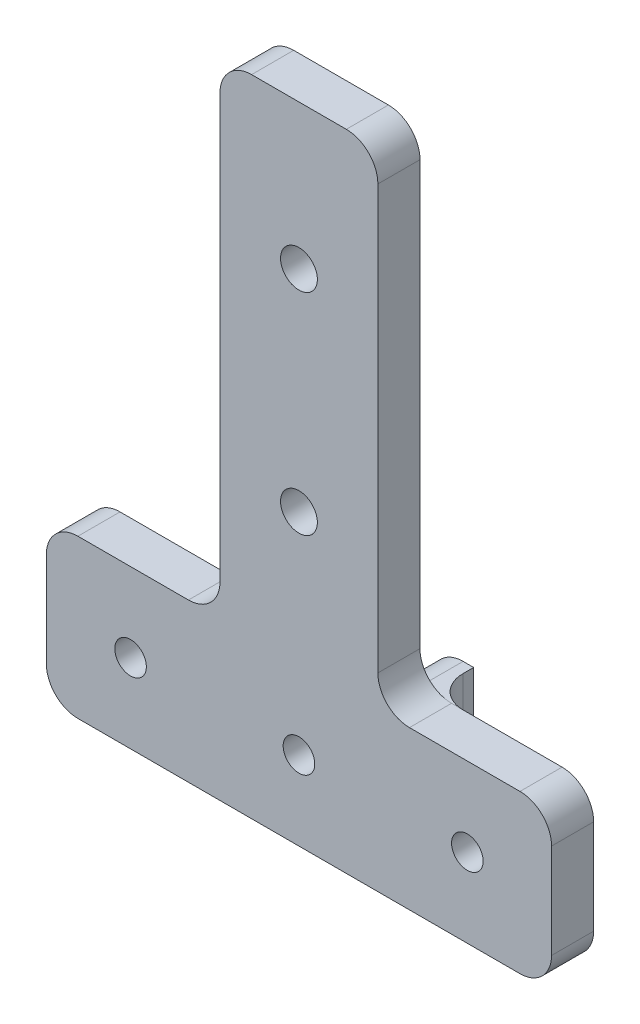
ISO-10303-21;
HEADER;
FILE_DESCRIPTION(('STEP AP214'),'2;1');
FILE_NAME('part.step','',(''),(''),'','','');
FILE_SCHEMA(('AUTOMOTIVE_DESIGN { 1 0 10303 214 1 1 1 1 }'));
ENDSEC;
DATA;
#1=APPLICATION_CONTEXT('core data for automotive mechanical design processes');
#2=APPLICATION_PROTOCOL_DEFINITION('international standard','automotive_design',2000,#1);
#3=PRODUCT_CONTEXT('',#1,'mechanical');
#4=PRODUCT('Part','Part','',(#3));
#5=PRODUCT_RELATED_PRODUCT_CATEGORY('part','',(#4));
#6=PRODUCT_DEFINITION_FORMATION('','',#4);
#7=PRODUCT_DEFINITION_CONTEXT('part definition',#1,'design');
#8=PRODUCT_DEFINITION('design','',#6,#7);
#9=PRODUCT_DEFINITION_SHAPE('','',#8);
#10=(LENGTH_UNIT() NAMED_UNIT(*) SI_UNIT(.MILLI.,.METRE.));
#11=(NAMED_UNIT(*) PLANE_ANGLE_UNIT() SI_UNIT($,.RADIAN.));
#12=(NAMED_UNIT(*) SI_UNIT($,.STERADIAN.) SOLID_ANGLE_UNIT());
#13=UNCERTAINTY_MEASURE_WITH_UNIT(LENGTH_MEASURE(1.E-05),#10,'distance_accuracy_value','');
#14=(GEOMETRIC_REPRESENTATION_CONTEXT(3) GLOBAL_UNCERTAINTY_ASSIGNED_CONTEXT((#13)) GLOBAL_UNIT_ASSIGNED_CONTEXT((#10,
#11,#12)) REPRESENTATION_CONTEXT('',''));
#15=CARTESIAN_POINT('',(0.,0.,0.));
#16=DIRECTION('',(0.,0.,1.));
#17=DIRECTION('',(1.,0.,0.));
#18=AXIS2_PLACEMENT_3D('',#15,#16,#17);
#19=CARTESIAN_POINT('',(0.,0.,0.));
#20=DIRECTION('',(0.,0.,1.));
#21=DIRECTION('',(1.,0.,0.));
#22=AXIS2_PLACEMENT_3D('',#19,#20,#21);
#23=PLANE('',#22);
#24=CARTESIAN_POINT('',(-16.,0.,0.));
#25=DIRECTION('',(0.,0.,1.));
#26=DIRECTION('',(1.,0.,0.));
#27=AXIS2_PLACEMENT_3D('',#24,#25,#26);
#28=CIRCLE('',#27,1.5);
#29=CARTESIAN_POINT('',(-14.5,0.,0.));
#30=VERTEX_POINT('',#29);
#31=EDGE_CURVE('E298',#30,#30,#28,.F.);
#32=ORIENTED_EDGE('',*,*,#31,.F.);
#33=EDGE_LOOP('',(#32));
#34=FACE_BOUND('',#33,.T.);
#35=DIRECTION('',(-1.,0.,0.));
#36=VECTOR('',#35,1.);
#37=CARTESIAN_POINT('',(0.,7.5,0.));
#38=LINE('',#37,#36);
#39=CARTESIAN_POINT('',(-11.6,7.5,0.));
#40=VERTEX_POINT('',#39);
#41=CARTESIAN_POINT('',(-21.,7.5,0.));
#42=VERTEX_POINT('',#41);
#43=EDGE_CURVE('E358',#40,#42,#38,.T.);
#44=ORIENTED_EDGE('',*,*,#43,.F.);
#45=DIRECTION('',(0.,-1.,0.));
#46=VECTOR('',#45,1.);
#47=CARTESIAN_POINT('',(-11.6,0.,0.));
#48=LINE('',#47,#46);
#49=CARTESIAN_POINT('',(-11.6,-7.5,0.));
#50=VERTEX_POINT('',#49);
#51=EDGE_CURVE('E508',#40,#50,#48,.T.);
#52=ORIENTED_EDGE('',*,*,#51,.T.);
#53=DIRECTION('',(-1.,0.,0.));
#54=VECTOR('',#53,1.);
#55=CARTESIAN_POINT('',(0.,-7.5,0.));
#56=LINE('',#55,#54);
#57=CARTESIAN_POINT('',(-21.,-7.5,0.));
#58=VERTEX_POINT('',#57);
#59=EDGE_CURVE('E367',#50,#58,#56,.T.);
#60=ORIENTED_EDGE('',*,*,#59,.T.);
#61=CARTESIAN_POINT('',(-21.,-4.5,0.));
#62=DIRECTION('',(0.,0.,1.));
#63=DIRECTION('',(1.,0.,0.));
#64=AXIS2_PLACEMENT_3D('',#61,#62,#63);
#65=CIRCLE('',#64,3.);
#66=CARTESIAN_POINT('',(-24.,-4.5,0.));
#67=VERTEX_POINT('',#66);
#68=EDGE_CURVE('E409',#58,#67,#65,.F.);
#69=ORIENTED_EDGE('',*,*,#68,.T.);
#70=DIRECTION('',(0.,-1.,0.));
#71=VECTOR('',#70,1.);
#72=CARTESIAN_POINT('',(-24.,0.,0.));
#73=LINE('',#72,#71);
#74=CARTESIAN_POINT('',(-24.,4.5,0.));
#75=VERTEX_POINT('',#74);
#76=EDGE_CURVE('E363',#75,#67,#73,.T.);
#77=ORIENTED_EDGE('',*,*,#76,.F.);
#78=CARTESIAN_POINT('',(-21.,4.5,0.));
#79=DIRECTION('',(0.,0.,1.));
#80=DIRECTION('',(1.,0.,0.));
#81=AXIS2_PLACEMENT_3D('',#78,#79,#80);
#82=CIRCLE('',#81,3.);
#83=EDGE_CURVE('E405',#75,#42,#82,.F.);
#84=ORIENTED_EDGE('',*,*,#83,.T.);
#85=EDGE_LOOP('',(#44,#52,#60,#69,#77,#84));
#86=FACE_BOUND('',#85,.T.);
#87=ADVANCED_FACE('F44',(#34,#86),#23,.F.);
#88=CARTESIAN_POINT('',(16.,0.,0.));
#89=DIRECTION('',(0.,0.,1.));
#90=DIRECTION('',(1.,0.,0.));
#91=AXIS2_PLACEMENT_3D('',#88,#89,#90);
#92=CIRCLE('',#91,1.5);
#93=CARTESIAN_POINT('',(17.5,0.,0.));
#94=VERTEX_POINT('',#93);
#95=EDGE_CURVE('E388',#94,#94,#92,.T.);
#96=ORIENTED_EDGE('',*,*,#95,.T.);
#97=EDGE_LOOP('',(#96));
#98=FACE_BOUND('',#97,.T.);
#99=CARTESIAN_POINT('',(21.,-7.5,0.));
#100=VERTEX_POINT('',#99);
#101=CARTESIAN_POINT('',(11.6,-7.5,0.));
#102=VERTEX_POINT('',#101);
#103=EDGE_CURVE('E368',#100,#102,#56,.T.);
#104=ORIENTED_EDGE('',*,*,#103,.T.);
#105=DIRECTION('',(0.,-1.,0.));
#106=VECTOR('',#105,1.);
#107=CARTESIAN_POINT('',(11.6,7.5,0.));
#108=LINE('',#107,#106);
#109=CARTESIAN_POINT('',(11.6,7.5,0.));
#110=VERTEX_POINT('',#109);
#111=EDGE_CURVE('E504',#102,#110,#108,.F.);
#112=ORIENTED_EDGE('',*,*,#111,.T.);
#113=DIRECTION('',(1.,0.,0.));
#114=VECTOR('',#113,1.);
#115=CARTESIAN_POINT('',(0.,7.5,0.));
#116=LINE('',#115,#114);
#117=CARTESIAN_POINT('',(21.,7.5,0.));
#118=VERTEX_POINT('',#117);
#119=EDGE_CURVE('E376',#110,#118,#116,.T.);
#120=ORIENTED_EDGE('',*,*,#119,.T.);
#121=CARTESIAN_POINT('',(21.,4.5,0.));
#122=DIRECTION('',(0.,0.,1.));
#123=DIRECTION('',(1.,0.,0.));
#124=AXIS2_PLACEMENT_3D('',#121,#122,#123);
#125=CIRCLE('',#124,3.);
#126=CARTESIAN_POINT('',(24.,4.5,0.));
#127=VERTEX_POINT('',#126);
#128=EDGE_CURVE('E415',#118,#127,#125,.F.);
#129=ORIENTED_EDGE('',*,*,#128,.T.);
#130=DIRECTION('',(0.,-1.,0.));
#131=VECTOR('',#130,1.);
#132=CARTESIAN_POINT('',(24.,0.,0.));
#133=LINE('',#132,#131);
#134=CARTESIAN_POINT('',(24.,-4.5,0.));
#135=VERTEX_POINT('',#134);
#136=EDGE_CURVE('E372',#127,#135,#133,.T.);
#137=ORIENTED_EDGE('',*,*,#136,.T.);
#138=CARTESIAN_POINT('',(21.,-4.5,0.));
#139=DIRECTION('',(0.,0.,1.));
#140=DIRECTION('',(1.,0.,0.));
#141=AXIS2_PLACEMENT_3D('',#138,#139,#140);
#142=CIRCLE('',#141,3.);
#143=EDGE_CURVE('E412',#135,#100,#142,.F.);
#144=ORIENTED_EDGE('',*,*,#143,.T.);
#145=EDGE_LOOP('',(#104,#112,#120,#129,#137,#144));
#146=FACE_BOUND('',#145,.T.);
#147=ADVANCED_FACE('F610',(#98,#146),#23,.F.);
#148=CARTESIAN_POINT('',(0.,0.,0.));
#149=DIRECTION('',(0.,0.,1.));
#150=DIRECTION('',(1.,0.,0.));
#151=AXIS2_PLACEMENT_3D('',#148,#149,#150);
#152=CIRCLE('',#151,1.5);
#153=CARTESIAN_POINT('',(1.5,0.,0.));
#154=VERTEX_POINT('',#153);
#155=EDGE_CURVE('E392',#154,#154,#152,.T.);
#156=ORIENTED_EDGE('',*,*,#155,.T.);
#157=EDGE_LOOP('',(#156));
#158=FACE_BOUND('',#157,.T.);
#159=CARTESIAN_POINT('',(0.,20.,0.));
#160=DIRECTION('',(0.,0.,1.));
#161=DIRECTION('',(1.,0.,0.));
#162=AXIS2_PLACEMENT_3D('',#159,#160,#161);
#163=CIRCLE('',#162,1.75);
#164=CARTESIAN_POINT('',(1.75,20.,0.));
#165=VERTEX_POINT('',#164);
#166=EDGE_CURVE('E350',#165,#165,#163,.T.);
#167=ORIENTED_EDGE('',*,*,#166,.T.);
#168=EDGE_LOOP('',(#167));
#169=FACE_BOUND('',#168,.T.);
#170=CARTESIAN_POINT('',(0.,40.,0.));
#171=DIRECTION('',(0.,0.,1.));
#172=DIRECTION('',(1.,0.,0.));
#173=AXIS2_PLACEMENT_3D('',#170,#171,#172);
#174=CIRCLE('',#173,1.75);
#175=CARTESIAN_POINT('',(1.75,40.,0.));
#176=VERTEX_POINT('',#175);
#177=EDGE_CURVE('E292',#176,#176,#174,.T.);
#178=ORIENTED_EDGE('',*,*,#177,.T.);
#179=EDGE_LOOP('',(#178));
#180=FACE_BOUND('',#179,.T.);
#181=DIRECTION('',(0.,-1.,0.));
#182=VECTOR('',#181,1.);
#183=CARTESIAN_POINT('',(-4.6,0.,0.));
#184=LINE('',#183,#182);
#185=CARTESIAN_POINT('',(-4.6,4.5,0.));
#186=VERTEX_POINT('',#185);
#187=CARTESIAN_POINT('',(-4.6,-7.5,0.));
#188=VERTEX_POINT('',#187);
#189=EDGE_CURVE('E259',#186,#188,#184,.T.);
#190=ORIENTED_EDGE('',*,*,#189,.F.);
#191=CARTESIAN_POINT('',(-7.6,4.5,0.));
#192=DIRECTION('',(0.,0.,1.));
#193=DIRECTION('',(1.,0.,0.));
#194=AXIS2_PLACEMENT_3D('',#191,#192,#193);
#195=CIRCLE('',#194,3.);
#196=CARTESIAN_POINT('',(-7.6,7.5,0.));
#197=VERTEX_POINT('',#196);
#198=EDGE_CURVE('E53',#186,#197,#195,.T.);
#199=ORIENTED_EDGE('',*,*,#198,.T.);
#200=DIRECTION('',(-1.,0.,0.));
#201=VECTOR('',#200,1.);
#202=CARTESIAN_POINT('',(0.,7.5,0.));
#203=LINE('',#202,#201);
#204=CARTESIAN_POINT('',(-10.5,7.5,0.));
#205=VERTEX_POINT('',#204);
#206=EDGE_CURVE('E254',#197,#205,#203,.T.);
#207=ORIENTED_EDGE('',*,*,#206,.T.);
#208=CARTESIAN_POINT('',(-10.5,10.5,0.));
#209=DIRECTION('',(0.,0.,1.));
#210=DIRECTION('',(1.,0.,0.));
#211=AXIS2_PLACEMENT_3D('',#208,#209,#210);
#212=CIRCLE('',#211,3.);
#213=CARTESIAN_POINT('',(-7.5,10.5,0.));
#214=VERTEX_POINT('',#213);
#215=EDGE_CURVE('E498',#205,#214,#212,.T.);
#216=ORIENTED_EDGE('',*,*,#215,.T.);
#217=DIRECTION('',(0.,1.,0.));
#218=VECTOR('',#217,1.);
#219=CARTESIAN_POINT('',(-7.5,0.,0.));
#220=LINE('',#219,#218);
#221=CARTESIAN_POINT('',(-7.5,50.7327989719016,0.));
#222=VERTEX_POINT('',#221);
#223=EDGE_CURVE('E354',#214,#222,#220,.T.);
#224=ORIENTED_EDGE('',*,*,#223,.T.);
#225=CARTESIAN_POINT('',(-4.5,50.7327989719016,0.));
#226=DIRECTION('',(0.,0.,1.));
#227=DIRECTION('',(1.,0.,0.));
#228=AXIS2_PLACEMENT_3D('',#225,#226,#227);
#229=CIRCLE('',#228,3.);
#230=CARTESIAN_POINT('',(-4.5,53.7327989719016,0.));
#231=VERTEX_POINT('',#230);
#232=EDGE_CURVE('E421',#222,#231,#229,.F.);
#233=ORIENTED_EDGE('',*,*,#232,.T.);
#234=DIRECTION('',(-1.,0.,0.));
#235=VECTOR('',#234,1.);
#236=CARTESIAN_POINT('',(0.,53.7327989719016,0.));
#237=LINE('',#236,#235);
#238=CARTESIAN_POINT('',(4.5,53.7327989719016,0.));
#239=VERTEX_POINT('',#238);
#240=EDGE_CURVE('E384',#239,#231,#237,.T.);
#241=ORIENTED_EDGE('',*,*,#240,.F.);
#242=CARTESIAN_POINT('',(4.5,50.7327989719016,0.));
#243=DIRECTION('',(0.,0.,1.));
#244=DIRECTION('',(1.,0.,0.));
#245=AXIS2_PLACEMENT_3D('',#242,#243,#244);
#246=CIRCLE('',#245,3.);
#247=CARTESIAN_POINT('',(7.5,50.7327989719016,0.));
#248=VERTEX_POINT('',#247);
#249=EDGE_CURVE('E418',#239,#248,#246,.F.);
#250=ORIENTED_EDGE('',*,*,#249,.T.);
#251=DIRECTION('',(0.,1.,0.));
#252=VECTOR('',#251,1.);
#253=CARTESIAN_POINT('',(7.5,0.,0.));
#254=LINE('',#253,#252);
#255=CARTESIAN_POINT('',(7.5,10.5,0.));
#256=VERTEX_POINT('',#255);
#257=EDGE_CURVE('E380',#256,#248,#254,.T.);
#258=ORIENTED_EDGE('',*,*,#257,.F.);
#259=CARTESIAN_POINT('',(10.5,10.5,0.));
#260=DIRECTION('',(0.,0.,1.));
#261=DIRECTION('',(1.,0.,0.));
#262=AXIS2_PLACEMENT_3D('',#259,#260,#261);
#263=CIRCLE('',#262,3.);
#264=CARTESIAN_POINT('',(10.5,7.5,0.));
#265=VERTEX_POINT('',#264);
#266=EDGE_CURVE('E491',#256,#265,#263,.T.);
#267=ORIENTED_EDGE('',*,*,#266,.T.);
#268=DIRECTION('',(1.,0.,0.));
#269=VECTOR('',#268,1.);
#270=CARTESIAN_POINT('',(0.,7.5,0.));
#271=LINE('',#270,#269);
#272=CARTESIAN_POINT('',(7.6,7.5,0.));
#273=VERTEX_POINT('',#272);
#274=EDGE_CURVE('E245',#273,#265,#271,.T.);
#275=ORIENTED_EDGE('',*,*,#274,.F.);
#276=CARTESIAN_POINT('',(7.6,4.5,0.));
#277=DIRECTION('',(0.,0.,1.));
#278=DIRECTION('',(1.,0.,0.));
#279=AXIS2_PLACEMENT_3D('',#276,#277,#278);
#280=CIRCLE('',#279,3.);
#281=CARTESIAN_POINT('',(4.59999999999999,4.5,0.));
#282=VERTEX_POINT('',#281);
#283=EDGE_CURVE('E11',#273,#282,#280,.T.);
#284=ORIENTED_EDGE('',*,*,#283,.T.);
#285=DIRECTION('',(0.,1.,0.));
#286=VECTOR('',#285,1.);
#287=CARTESIAN_POINT('',(4.6,0.,0.));
#288=LINE('',#287,#286);
#289=CARTESIAN_POINT('',(4.6,-7.5,0.));
#290=VERTEX_POINT('',#289);
#291=EDGE_CURVE('E586',#290,#282,#288,.T.);
#292=ORIENTED_EDGE('',*,*,#291,.F.);
#293=EDGE_CURVE('E252',#290,#188,#56,.T.);
#294=ORIENTED_EDGE('',*,*,#293,.T.);
#295=EDGE_LOOP('',(#190,#199,#207,#216,#224,#233,#241,#250,#258,#267,#275,#284,#292,#294));
#296=FACE_BOUND('',#295,.T.);
#297=ADVANCED_FACE('F552',(#158,#169,#180,#296),#23,.F.);
#298=CARTESIAN_POINT('',(-7.5,0.,4.));
#299=DIRECTION('',(-1.,0.,0.));
#300=DIRECTION('',(0.,0.,1.));
#301=AXIS2_PLACEMENT_3D('',#298,#299,#300);
#302=PLANE('',#301);
#303=DIRECTION('',(0.,1.,0.));
#304=VECTOR('',#303,1.);
#305=CARTESIAN_POINT('',(-7.5,0.,4.));
#306=LINE('',#305,#304);
#307=CARTESIAN_POINT('',(-7.5,10.5,4.));
#308=VERTEX_POINT('',#307);
#309=CARTESIAN_POINT('',(-7.5,50.7327989719016,4.));
#310=VERTEX_POINT('',#309);
#311=EDGE_CURVE('E302',#308,#310,#306,.T.);
#312=ORIENTED_EDGE('',*,*,#311,.T.);
#313=DIRECTION('',(0.,0.,-1.));
#314=VECTOR('',#313,1.);
#315=CARTESIAN_POINT('',(-7.5,50.7327989719016,0.));
#316=LINE('',#315,#314);
#317=EDGE_CURVE('E401',#310,#222,#316,.T.);
#318=ORIENTED_EDGE('',*,*,#317,.T.);
#319=ORIENTED_EDGE('',*,*,#223,.F.);
#320=DIRECTION('',(0.,0.,-1.));
#321=VECTOR('',#320,1.);
#322=CARTESIAN_POINT('',(-7.5,10.5,4.));
#323=LINE('',#322,#321);
#324=EDGE_CURVE('E346',#214,#308,#323,.F.);
#325=ORIENTED_EDGE('',*,*,#324,.T.);
#326=EDGE_LOOP('',(#312,#318,#319,#325));
#327=FACE_BOUND('',#326,.T.);
#328=ADVANCED_FACE('F660',(#327),#302,.T.);
#329=CARTESIAN_POINT('',(0.,7.5,4.));
#330=DIRECTION('',(0.,-1.,0.));
#331=DIRECTION('',(0.,0.,-1.));
#332=AXIS2_PLACEMENT_3D('',#329,#330,#331);
#333=PLANE('',#332);
#334=EDGE_CURVE('E359',#205,#40,#38,.T.);
#335=ORIENTED_EDGE('',*,*,#334,.T.);
#336=ORIENTED_EDGE('',*,*,#43,.T.);
#337=DIRECTION('',(0.,0.,-1.));
#338=VECTOR('',#337,1.);
#339=CARTESIAN_POINT('',(-21.,7.5,4.));
#340=LINE('',#339,#338);
#341=CARTESIAN_POINT('',(-21.,7.5,4.));
#342=VERTEX_POINT('',#341);
#343=EDGE_CURVE('E488',#42,#342,#340,.F.);
#344=ORIENTED_EDGE('',*,*,#343,.T.);
#345=DIRECTION('',(-1.,0.,0.));
#346=VECTOR('',#345,1.);
#347=CARTESIAN_POINT('',(0.,7.5,4.));
#348=LINE('',#347,#346);
#349=CARTESIAN_POINT('',(-10.5,7.5,4.));
#350=VERTEX_POINT('',#349);
#351=EDGE_CURVE('E306',#350,#342,#348,.T.);
#352=ORIENTED_EDGE('',*,*,#351,.F.);
#353=DIRECTION('',(0.,0.,-1.));
#354=VECTOR('',#353,1.);
#355=CARTESIAN_POINT('',(-10.5,7.5,4.));
#356=LINE('',#355,#354);
#357=EDGE_CURVE('E484',#350,#205,#356,.T.);
#358=ORIENTED_EDGE('',*,*,#357,.T.);
#359=EDGE_LOOP('',(#335,#336,#344,#352,#358));
#360=FACE_BOUND('',#359,.T.);
#361=ADVANCED_FACE('F670',(#360),#333,.F.);
#362=CARTESIAN_POINT('',(-24.,0.,4.));
#363=DIRECTION('',(1.,0.,0.));
#364=DIRECTION('',(0.,0.,-1.));
#365=AXIS2_PLACEMENT_3D('',#362,#363,#364);
#366=PLANE('',#365);
#367=ORIENTED_EDGE('',*,*,#76,.T.);
#368=DIRECTION('',(0.,0.,-1.));
#369=VECTOR('',#368,1.);
#370=CARTESIAN_POINT('',(-24.,-4.5,4.));
#371=LINE('',#370,#369);
#372=CARTESIAN_POINT('',(-24.,-4.5,4.));
#373=VERTEX_POINT('',#372);
#374=EDGE_CURVE('E481',#67,#373,#371,.F.);
#375=ORIENTED_EDGE('',*,*,#374,.T.);
#376=DIRECTION('',(0.,-1.,0.));
#377=VECTOR('',#376,1.);
#378=CARTESIAN_POINT('',(-24.,0.,4.));
#379=LINE('',#378,#377);
#380=CARTESIAN_POINT('',(-24.,4.5,4.));
#381=VERTEX_POINT('',#380);
#382=EDGE_CURVE('E310',#381,#373,#379,.T.);
#383=ORIENTED_EDGE('',*,*,#382,.F.);
#384=DIRECTION('',(0.,0.,-1.));
#385=VECTOR('',#384,1.);
#386=CARTESIAN_POINT('',(-24.,4.5,4.));
#387=LINE('',#386,#385);
#388=EDGE_CURVE('E477',#381,#75,#387,.T.);
#389=ORIENTED_EDGE('',*,*,#388,.T.);
#390=EDGE_LOOP('',(#367,#375,#383,#389));
#391=FACE_BOUND('',#390,.T.);
#392=ADVANCED_FACE('F678',(#391),#366,.F.);
#393=CARTESIAN_POINT('',(0.,-7.5,4.));
#394=DIRECTION('',(0.,-1.,0.));
#395=DIRECTION('',(0.,0.,-1.));
#396=AXIS2_PLACEMENT_3D('',#393,#394,#395);
#397=PLANE('',#396);
#398=ORIENTED_EDGE('',*,*,#103,.F.);
#399=DIRECTION('',(0.,0.,-1.));
#400=VECTOR('',#399,1.);
#401=CARTESIAN_POINT('',(21.,-7.5,4.));
#402=LINE('',#401,#400);
#403=CARTESIAN_POINT('',(21.,-7.5,4.));
#404=VERTEX_POINT('',#403);
#405=EDGE_CURVE('E474',#100,#404,#402,.F.);
#406=ORIENTED_EDGE('',*,*,#405,.T.);
#407=DIRECTION('',(-1.,0.,0.));
#408=VECTOR('',#407,1.);
#409=CARTESIAN_POINT('',(0.,-7.5,4.));
#410=LINE('',#409,#408);
#411=CARTESIAN_POINT('',(-21.,-7.5,4.));
#412=VERTEX_POINT('',#411);
#413=EDGE_CURVE('E314',#404,#412,#410,.T.);
#414=ORIENTED_EDGE('',*,*,#413,.T.);
#415=DIRECTION('',(0.,0.,-1.));
#416=VECTOR('',#415,1.);
#417=CARTESIAN_POINT('',(-21.,-7.5,0.));
#418=LINE('',#417,#416);
#419=EDGE_CURVE('E470',#412,#58,#418,.T.);
#420=ORIENTED_EDGE('',*,*,#419,.T.);
#421=ORIENTED_EDGE('',*,*,#59,.F.);
#422=CARTESIAN_POINT('',(-11.6,-7.5,-3.));
#423=DIRECTION('',(0.,-1.,0.));
#424=DIRECTION('',(0.,0.,-1.));
#425=AXIS2_PLACEMENT_3D('',#422,#423,#424);
#426=CIRCLE('',#425,3.);
#427=CARTESIAN_POINT('',(-8.6,-7.5,-3.));
#428=VERTEX_POINT('',#427);
#429=EDGE_CURVE('E519',#50,#428,#426,.F.);
#430=ORIENTED_EDGE('',*,*,#429,.T.);
#431=DIRECTION('',(0.,0.,1.));
#432=VECTOR('',#431,1.);
#433=CARTESIAN_POINT('',(-8.6,-7.5,-4.));
#434=LINE('',#433,#432);
#435=CARTESIAN_POINT('',(-8.6,-7.5,-4.));
#436=VERTEX_POINT('',#435);
#437=EDGE_CURVE('E285',#436,#428,#434,.T.);
#438=ORIENTED_EDGE('',*,*,#437,.F.);
#439=DIRECTION('',(-1.,0.,0.));
#440=VECTOR('',#439,1.);
#441=CARTESIAN_POINT('',(0.,-7.5,-4.));
#442=LINE('',#441,#440);
#443=CARTESIAN_POINT('',(-4.6,-7.5,-4.));
#444=VERTEX_POINT('',#443);
#445=EDGE_CURVE('E272',#444,#436,#442,.T.);
#446=ORIENTED_EDGE('',*,*,#445,.F.);
#447=DIRECTION('',(0.,0.,1.));
#448=VECTOR('',#447,1.);
#449=CARTESIAN_POINT('',(-4.6,-7.5,-4.));
#450=LINE('',#449,#448);
#451=EDGE_CURVE('E289',#444,#188,#450,.T.);
#452=ORIENTED_EDGE('',*,*,#451,.T.);
#453=ORIENTED_EDGE('',*,*,#293,.F.);
#454=DIRECTION('',(0.,0.,1.));
#455=VECTOR('',#454,1.);
#456=CARTESIAN_POINT('',(4.6,-7.5,-4.));
#457=LINE('',#456,#455);
#458=CARTESIAN_POINT('',(4.6,-7.5,-4.));
#459=VERTEX_POINT('',#458);
#460=EDGE_CURVE('E230',#459,#290,#457,.T.);
#461=ORIENTED_EDGE('',*,*,#460,.F.);
#462=DIRECTION('',(-1.,0.,0.));
#463=VECTOR('',#462,1.);
#464=CARTESIAN_POINT('',(0.,-7.5,-4.));
#465=LINE('',#464,#463);
#466=CARTESIAN_POINT('',(8.6,-7.5,-4.));
#467=VERTEX_POINT('',#466);
#468=EDGE_CURVE('E235',#467,#459,#465,.T.);
#469=ORIENTED_EDGE('',*,*,#468,.F.);
#470=DIRECTION('',(0.,0.,1.));
#471=VECTOR('',#470,1.);
#472=CARTESIAN_POINT('',(8.6,-7.5,-4.));
#473=LINE('',#472,#471);
#474=CARTESIAN_POINT('',(8.6,-7.5,-3.));
#475=VERTEX_POINT('',#474);
#476=EDGE_CURVE('E262',#467,#475,#473,.T.);
#477=ORIENTED_EDGE('',*,*,#476,.T.);
#478=CARTESIAN_POINT('',(11.6,-7.5,-3.));
#479=DIRECTION('',(0.,-1.,0.));
#480=DIRECTION('',(0.,0.,-1.));
#481=AXIS2_PLACEMENT_3D('',#478,#479,#480);
#482=CIRCLE('',#481,3.);
#483=EDGE_CURVE('E525',#475,#102,#482,.F.);
#484=ORIENTED_EDGE('',*,*,#483,.T.);
#485=EDGE_LOOP('',(#398,#406,#414,#420,#421,#430,#438,#446,#452,#453,#461,#469,#477,#484));
#486=FACE_BOUND('',#485,.T.);
#487=ADVANCED_FACE('F249',(#486),#397,.T.);
#488=CARTESIAN_POINT('',(24.,0.,4.));
#489=DIRECTION('',(1.,0.,0.));
#490=DIRECTION('',(0.,0.,-1.));
#491=AXIS2_PLACEMENT_3D('',#488,#489,#490);
#492=PLANE('',#491);
#493=ORIENTED_EDGE('',*,*,#136,.F.);
#494=DIRECTION('',(0.,0.,-1.));
#495=VECTOR('',#494,1.);
#496=CARTESIAN_POINT('',(24.,4.5,4.));
#497=LINE('',#496,#495);
#498=CARTESIAN_POINT('',(24.,4.5,4.));
#499=VERTEX_POINT('',#498);
#500=EDGE_CURVE('E467',#127,#499,#497,.F.);
#501=ORIENTED_EDGE('',*,*,#500,.T.);
#502=DIRECTION('',(0.,-1.,0.));
#503=VECTOR('',#502,1.);
#504=CARTESIAN_POINT('',(24.,0.,4.));
#505=LINE('',#504,#503);
#506=CARTESIAN_POINT('',(24.,-4.5,4.));
#507=VERTEX_POINT('',#506);
#508=EDGE_CURVE('E318',#499,#507,#505,.T.);
#509=ORIENTED_EDGE('',*,*,#508,.T.);
#510=DIRECTION('',(0.,0.,-1.));
#511=VECTOR('',#510,1.);
#512=CARTESIAN_POINT('',(24.,-4.5,4.));
#513=LINE('',#512,#511);
#514=EDGE_CURVE('E463',#507,#135,#513,.T.);
#515=ORIENTED_EDGE('',*,*,#514,.T.);
#516=EDGE_LOOP('',(#493,#501,#509,#515));
#517=FACE_BOUND('',#516,.T.);
#518=ADVANCED_FACE('F618',(#517),#492,.T.);
#519=CARTESIAN_POINT('',(0.,7.5,4.));
#520=DIRECTION('',(0.,1.,0.));
#521=DIRECTION('',(0.,0.,1.));
#522=AXIS2_PLACEMENT_3D('',#519,#520,#521);
#523=PLANE('',#522);
#524=EDGE_CURVE('E377',#265,#110,#116,.T.);
#525=ORIENTED_EDGE('',*,*,#524,.F.);
#526=DIRECTION('',(0.,0.,-1.));
#527=VECTOR('',#526,1.);
#528=CARTESIAN_POINT('',(10.5,7.5,4.));
#529=LINE('',#528,#527);
#530=CARTESIAN_POINT('',(10.5,7.5,4.));
#531=VERTEX_POINT('',#530);
#532=EDGE_CURVE('E460',#265,#531,#529,.F.);
#533=ORIENTED_EDGE('',*,*,#532,.T.);
#534=DIRECTION('',(1.,0.,0.));
#535=VECTOR('',#534,1.);
#536=CARTESIAN_POINT('',(0.,7.5,4.));
#537=LINE('',#536,#535);
#538=CARTESIAN_POINT('',(21.,7.5,4.));
#539=VERTEX_POINT('',#538);
#540=EDGE_CURVE('E322',#531,#539,#537,.T.);
#541=ORIENTED_EDGE('',*,*,#540,.T.);
#542=DIRECTION('',(0.,0.,-1.));
#543=VECTOR('',#542,1.);
#544=CARTESIAN_POINT('',(21.,7.5,4.));
#545=LINE('',#544,#543);
#546=EDGE_CURVE('E456',#539,#118,#545,.T.);
#547=ORIENTED_EDGE('',*,*,#546,.T.);
#548=ORIENTED_EDGE('',*,*,#119,.F.);
#549=EDGE_LOOP('',(#525,#533,#541,#547,#548));
#550=FACE_BOUND('',#549,.T.);
#551=ADVANCED_FACE('F633',(#550),#523,.T.);
#552=CARTESIAN_POINT('',(7.5,0.,4.));
#553=DIRECTION('',(-1.,0.,0.));
#554=DIRECTION('',(0.,0.,1.));
#555=AXIS2_PLACEMENT_3D('',#552,#553,#554);
#556=PLANE('',#555);
#557=ORIENTED_EDGE('',*,*,#257,.T.);
#558=DIRECTION('',(0.,0.,-1.));
#559=VECTOR('',#558,1.);
#560=CARTESIAN_POINT('',(7.5,50.7327989719016,4.));
#561=LINE('',#560,#559);
#562=CARTESIAN_POINT('',(7.5,50.7327989719016,4.));
#563=VERTEX_POINT('',#562);
#564=EDGE_CURVE('E453',#248,#563,#561,.F.);
#565=ORIENTED_EDGE('',*,*,#564,.T.);
#566=DIRECTION('',(0.,1.,0.));
#567=VECTOR('',#566,1.);
#568=CARTESIAN_POINT('',(7.5,0.,4.));
#569=LINE('',#568,#567);
#570=CARTESIAN_POINT('',(7.5,10.5,4.));
#571=VERTEX_POINT('',#570);
#572=EDGE_CURVE('E326',#571,#563,#569,.T.);
#573=ORIENTED_EDGE('',*,*,#572,.F.);
#574=DIRECTION('',(0.,0.,-1.));
#575=VECTOR('',#574,1.);
#576=CARTESIAN_POINT('',(7.5,10.5,4.));
#577=LINE('',#576,#575);
#578=EDGE_CURVE('E449',#571,#256,#577,.T.);
#579=ORIENTED_EDGE('',*,*,#578,.T.);
#580=EDGE_LOOP('',(#557,#565,#573,#579));
#581=FACE_BOUND('',#580,.T.);
#582=ADVANCED_FACE('F642',(#581),#556,.F.);
#583=CARTESIAN_POINT('',(0.,0.,4.));
#584=DIRECTION('',(0.,0.,-1.));
#585=DIRECTION('',(-1.,0.,0.));
#586=AXIS2_PLACEMENT_3D('',#583,#584,#585);
#587=CYLINDRICAL_SURFACE('',#586,1.5);
#588=CARTESIAN_POINT('',(0.,0.,4.));
#589=DIRECTION('',(0.,0.,1.));
#590=DIRECTION('',(1.,0.,0.));
#591=AXIS2_PLACEMENT_3D('',#588,#589,#590);
#592=CIRCLE('',#591,1.5);
#593=CARTESIAN_POINT('',(1.5,0.,4.));
#594=VERTEX_POINT('',#593);
#595=EDGE_CURVE('E338',#594,#594,#592,.T.);
#596=ORIENTED_EDGE('',*,*,#595,.T.);
#597=EDGE_LOOP('',(#596));
#598=FACE_BOUND('',#597,.T.);
#599=ORIENTED_EDGE('',*,*,#155,.F.);
#600=EDGE_LOOP('',(#599));
#601=FACE_BOUND('',#600,.T.);
#602=ADVANCED_FACE('F979',(#598,#601),#587,.F.);
#603=CARTESIAN_POINT('',(16.,0.,4.));
#604=DIRECTION('',(0.,0.,-1.));
#605=DIRECTION('',(-1.,0.,0.));
#606=AXIS2_PLACEMENT_3D('',#603,#604,#605);
#607=CYLINDRICAL_SURFACE('',#606,1.5);
#608=CARTESIAN_POINT('',(16.,0.,4.));
#609=DIRECTION('',(0.,0.,1.));
#610=DIRECTION('',(1.,0.,0.));
#611=AXIS2_PLACEMENT_3D('',#608,#609,#610);
#612=CIRCLE('',#611,1.5);
#613=CARTESIAN_POINT('',(17.5,0.,4.));
#614=VERTEX_POINT('',#613);
#615=EDGE_CURVE('E334',#614,#614,#612,.T.);
#616=ORIENTED_EDGE('',*,*,#615,.T.);
#617=EDGE_LOOP('',(#616));
#618=FACE_BOUND('',#617,.T.);
#619=ORIENTED_EDGE('',*,*,#95,.F.);
#620=EDGE_LOOP('',(#619));
#621=FACE_BOUND('',#620,.T.);
#622=ADVANCED_FACE('F970',(#618,#621),#607,.F.);
#623=CARTESIAN_POINT('',(0.,53.7327989719016,4.));
#624=DIRECTION('',(0.,-1.,0.));
#625=DIRECTION('',(0.,0.,-1.));
#626=AXIS2_PLACEMENT_3D('',#623,#624,#625);
#627=PLANE('',#626);
#628=ORIENTED_EDGE('',*,*,#240,.T.);
#629=DIRECTION('',(0.,0.,-1.));
#630=VECTOR('',#629,1.);
#631=CARTESIAN_POINT('',(-4.5,53.7327989719016,4.));
#632=LINE('',#631,#630);
#633=CARTESIAN_POINT('',(-4.5,53.7327989719016,4.));
#634=VERTEX_POINT('',#633);
#635=EDGE_CURVE('E428',#231,#634,#632,.F.);
#636=ORIENTED_EDGE('',*,*,#635,.T.);
#637=DIRECTION('',(-1.,0.,0.));
#638=VECTOR('',#637,1.);
#639=CARTESIAN_POINT('',(0.,53.7327989719016,4.));
#640=LINE('',#639,#638);
#641=CARTESIAN_POINT('',(4.5,53.7327989719016,4.));
#642=VERTEX_POINT('',#641);
#643=EDGE_CURVE('E330',#642,#634,#640,.T.);
#644=ORIENTED_EDGE('',*,*,#643,.F.);
#645=DIRECTION('',(0.,0.,-1.));
#646=VECTOR('',#645,1.);
#647=CARTESIAN_POINT('',(4.5,53.7327989719016,4.));
#648=LINE('',#647,#646);
#649=EDGE_CURVE('E424',#642,#239,#648,.T.);
#650=ORIENTED_EDGE('',*,*,#649,.T.);
#651=EDGE_LOOP('',(#628,#636,#644,#650));
#652=FACE_BOUND('',#651,.T.);
#653=ADVANCED_FACE('F651',(#652),#627,.F.);
#654=CARTESIAN_POINT('',(0.,20.,4.));
#655=DIRECTION('',(0.,0.,-1.));
#656=DIRECTION('',(-1.,0.,0.));
#657=AXIS2_PLACEMENT_3D('',#654,#655,#656);
#658=CYLINDRICAL_SURFACE('',#657,1.75);
#659=CARTESIAN_POINT('',(0.,20.,4.));
#660=DIRECTION('',(0.,0.,1.));
#661=DIRECTION('',(1.,0.,0.));
#662=AXIS2_PLACEMENT_3D('',#659,#660,#661);
#663=CIRCLE('',#662,1.75);
#664=CARTESIAN_POINT('',(1.75,20.,4.));
#665=VERTEX_POINT('',#664);
#666=EDGE_CURVE('E297',#665,#665,#663,.T.);
#667=ORIENTED_EDGE('',*,*,#666,.T.);
#668=EDGE_LOOP('',(#667));
#669=FACE_BOUND('',#668,.T.);
#670=ORIENTED_EDGE('',*,*,#166,.F.);
#671=EDGE_LOOP('',(#670));
#672=FACE_BOUND('',#671,.T.);
#673=ADVANCED_FACE('F719',(#669,#672),#658,.F.);
#674=CARTESIAN_POINT('',(0.,40.,4.));
#675=DIRECTION('',(0.,0.,-1.));
#676=DIRECTION('',(-1.,0.,0.));
#677=AXIS2_PLACEMENT_3D('',#674,#675,#676);
#678=CYLINDRICAL_SURFACE('',#677,1.75);
#679=CARTESIAN_POINT('',(0.,40.,4.));
#680=DIRECTION('',(0.,0.,1.));
#681=DIRECTION('',(1.,0.,0.));
#682=AXIS2_PLACEMENT_3D('',#679,#680,#681);
#683=CIRCLE('',#682,1.75);
#684=CARTESIAN_POINT('',(1.75,40.,4.));
#685=VERTEX_POINT('',#684);
#686=EDGE_CURVE('E293',#685,#685,#683,.T.);
#687=ORIENTED_EDGE('',*,*,#686,.T.);
#688=EDGE_LOOP('',(#687));
#689=FACE_BOUND('',#688,.T.);
#690=ORIENTED_EDGE('',*,*,#177,.F.);
#691=EDGE_LOOP('',(#690));
#692=FACE_BOUND('',#691,.T.);
#693=ADVANCED_FACE('F716',(#689,#692),#678,.F.);
#694=CARTESIAN_POINT('',(-16.,0.,4.));
#695=DIRECTION('',(0.,0.,-1.));
#696=DIRECTION('',(-1.,0.,0.));
#697=AXIS2_PLACEMENT_3D('',#694,#695,#696);
#698=CYLINDRICAL_SURFACE('',#697,1.5);
#699=CARTESIAN_POINT('',(-16.,0.,4.));
#700=DIRECTION('',(0.,0.,1.));
#701=DIRECTION('',(1.,0.,0.));
#702=AXIS2_PLACEMENT_3D('',#699,#700,#701);
#703=CIRCLE('',#702,1.5);
#704=CARTESIAN_POINT('',(-14.5,0.,4.));
#705=VERTEX_POINT('',#704);
#706=EDGE_CURVE('E342',#705,#705,#703,.F.);
#707=ORIENTED_EDGE('',*,*,#706,.F.);
#708=EDGE_LOOP('',(#707));
#709=FACE_BOUND('',#708,.T.);
#710=ORIENTED_EDGE('',*,*,#31,.T.);
#711=EDGE_LOOP('',(#710));
#712=FACE_BOUND('',#711,.T.);
#713=ADVANCED_FACE('F718',(#709,#712),#698,.F.);
#714=CARTESIAN_POINT('',(0.,0.,4.));
#715=DIRECTION('',(0.,0.,1.));
#716=DIRECTION('',(1.,0.,0.));
#717=AXIS2_PLACEMENT_3D('',#714,#715,#716);
#718=PLANE('',#717);
#719=ORIENTED_EDGE('',*,*,#686,.F.);
#720=EDGE_LOOP('',(#719));
#721=FACE_BOUND('',#720,.T.);
#722=ORIENTED_EDGE('',*,*,#666,.F.);
#723=EDGE_LOOP('',(#722));
#724=FACE_BOUND('',#723,.T.);
#725=ORIENTED_EDGE('',*,*,#643,.T.);
#726=CARTESIAN_POINT('',(-4.5,50.7327989719016,4.));
#727=DIRECTION('',(0.,0.,1.));
#728=DIRECTION('',(1.,0.,0.));
#729=AXIS2_PLACEMENT_3D('',#726,#727,#728);
#730=CIRCLE('',#729,3.);
#731=EDGE_CURVE('E446',#634,#310,#730,.T.);
#732=ORIENTED_EDGE('',*,*,#731,.T.);
#733=ORIENTED_EDGE('',*,*,#311,.F.);
#734=CARTESIAN_POINT('',(-10.5,10.5,4.));
#735=DIRECTION('',(0.,0.,1.));
#736=DIRECTION('',(1.,0.,0.));
#737=AXIS2_PLACEMENT_3D('',#734,#735,#736);
#738=CIRCLE('',#737,3.);
#739=EDGE_CURVE('E501',#308,#350,#738,.F.);
#740=ORIENTED_EDGE('',*,*,#739,.T.);
#741=ORIENTED_EDGE('',*,*,#351,.T.);
#742=CARTESIAN_POINT('',(-21.,4.5,4.));
#743=DIRECTION('',(0.,0.,1.));
#744=DIRECTION('',(1.,0.,0.));
#745=AXIS2_PLACEMENT_3D('',#742,#743,#744);
#746=CIRCLE('',#745,3.);
#747=EDGE_CURVE('E431',#342,#381,#746,.T.);
#748=ORIENTED_EDGE('',*,*,#747,.T.);
#749=ORIENTED_EDGE('',*,*,#382,.T.);
#750=CARTESIAN_POINT('',(-21.,-4.5,4.));
#751=DIRECTION('',(0.,0.,1.));
#752=DIRECTION('',(1.,0.,0.));
#753=AXIS2_PLACEMENT_3D('',#750,#751,#752);
#754=CIRCLE('',#753,3.);
#755=EDGE_CURVE('E434',#373,#412,#754,.T.);
#756=ORIENTED_EDGE('',*,*,#755,.T.);
#757=ORIENTED_EDGE('',*,*,#413,.F.);
#758=CARTESIAN_POINT('',(21.,-4.5,4.));
#759=DIRECTION('',(0.,0.,1.));
#760=DIRECTION('',(1.,0.,0.));
#761=AXIS2_PLACEMENT_3D('',#758,#759,#760);
#762=CIRCLE('',#761,3.);
#763=EDGE_CURVE('E437',#404,#507,#762,.T.);
#764=ORIENTED_EDGE('',*,*,#763,.T.);
#765=ORIENTED_EDGE('',*,*,#508,.F.);
#766=CARTESIAN_POINT('',(21.,4.5,4.));
#767=DIRECTION('',(0.,0.,1.));
#768=DIRECTION('',(1.,0.,0.));
#769=AXIS2_PLACEMENT_3D('',#766,#767,#768);
#770=CIRCLE('',#769,3.);
#771=EDGE_CURVE('E440',#499,#539,#770,.T.);
#772=ORIENTED_EDGE('',*,*,#771,.T.);
#773=ORIENTED_EDGE('',*,*,#540,.F.);
#774=CARTESIAN_POINT('',(10.5,10.5,4.));
#775=DIRECTION('',(0.,0.,1.));
#776=DIRECTION('',(1.,0.,0.));
#777=AXIS2_PLACEMENT_3D('',#774,#775,#776);
#778=CIRCLE('',#777,3.);
#779=EDGE_CURVE('E495',#531,#571,#778,.F.);
#780=ORIENTED_EDGE('',*,*,#779,.T.);
#781=ORIENTED_EDGE('',*,*,#572,.T.);
#782=CARTESIAN_POINT('',(4.5,50.7327989719016,4.));
#783=DIRECTION('',(0.,0.,1.));
#784=DIRECTION('',(1.,0.,0.));
#785=AXIS2_PLACEMENT_3D('',#782,#783,#784);
#786=CIRCLE('',#785,3.);
#787=EDGE_CURVE('E443',#563,#642,#786,.T.);
#788=ORIENTED_EDGE('',*,*,#787,.T.);
#789=EDGE_LOOP('',(#725,#732,#733,#740,#741,#748,#749,#756,#757,#764,#765,#772,#773,#780,#781,#788));
#790=FACE_BOUND('',#789,.T.);
#791=ORIENTED_EDGE('',*,*,#615,.F.);
#792=EDGE_LOOP('',(#791));
#793=FACE_BOUND('',#792,.T.);
#794=ORIENTED_EDGE('',*,*,#595,.F.);
#795=EDGE_LOOP('',(#794));
#796=FACE_BOUND('',#795,.T.);
#797=ORIENTED_EDGE('',*,*,#706,.T.);
#798=EDGE_LOOP('',(#797));
#799=FACE_BOUND('',#798,.T.);
#800=ADVANCED_FACE('F623',(#721,#724,#790,#793,#796,#799),#718,.T.);
#801=CARTESIAN_POINT('',(-4.5,50.7327989719016,4.));
#802=DIRECTION('',(0.,0.,1.));
#803=DIRECTION('',(1.,0.,0.));
#804=AXIS2_PLACEMENT_3D('',#801,#802,#803);
#805=CYLINDRICAL_SURFACE('',#804,3.);
#806=ORIENTED_EDGE('',*,*,#731,.F.);
#807=ORIENTED_EDGE('',*,*,#635,.F.);
#808=ORIENTED_EDGE('',*,*,#232,.F.);
#809=ORIENTED_EDGE('',*,*,#317,.F.);
#810=EDGE_LOOP('',(#806,#807,#808,#809));
#811=FACE_BOUND('',#810,.T.);
#812=ADVANCED_FACE('F657',(#811),#805,.T.);
#813=CARTESIAN_POINT('',(4.5,50.7327989719016,4.));
#814=DIRECTION('',(0.,0.,-1.));
#815=DIRECTION('',(-1.,0.,0.));
#816=AXIS2_PLACEMENT_3D('',#813,#814,#815);
#817=CYLINDRICAL_SURFACE('',#816,3.);
#818=ORIENTED_EDGE('',*,*,#787,.F.);
#819=ORIENTED_EDGE('',*,*,#564,.F.);
#820=ORIENTED_EDGE('',*,*,#249,.F.);
#821=ORIENTED_EDGE('',*,*,#649,.F.);
#822=EDGE_LOOP('',(#818,#819,#820,#821));
#823=FACE_BOUND('',#822,.T.);
#824=ADVANCED_FACE('F648',(#823),#817,.T.);
#825=CARTESIAN_POINT('',(10.5,10.5,4.));
#826=DIRECTION('',(0.,0.,-1.));
#827=DIRECTION('',(-1.,0.,0.));
#828=AXIS2_PLACEMENT_3D('',#825,#826,#827);
#829=CYLINDRICAL_SURFACE('',#828,3.);
#830=ORIENTED_EDGE('',*,*,#779,.F.);
#831=ORIENTED_EDGE('',*,*,#532,.F.);
#832=ORIENTED_EDGE('',*,*,#266,.F.);
#833=ORIENTED_EDGE('',*,*,#578,.F.);
#834=EDGE_LOOP('',(#830,#831,#832,#833));
#835=FACE_BOUND('',#834,.T.);
#836=ADVANCED_FACE('F639',(#835),#829,.F.);
#837=CARTESIAN_POINT('',(21.,4.5,4.));
#838=DIRECTION('',(0.,0.,-1.));
#839=DIRECTION('',(-1.,0.,0.));
#840=AXIS2_PLACEMENT_3D('',#837,#838,#839);
#841=CYLINDRICAL_SURFACE('',#840,3.);
#842=ORIENTED_EDGE('',*,*,#771,.F.);
#843=ORIENTED_EDGE('',*,*,#500,.F.);
#844=ORIENTED_EDGE('',*,*,#128,.F.);
#845=ORIENTED_EDGE('',*,*,#546,.F.);
#846=EDGE_LOOP('',(#842,#843,#844,#845));
#847=FACE_BOUND('',#846,.T.);
#848=ADVANCED_FACE('F629',(#847),#841,.T.);
#849=CARTESIAN_POINT('',(21.,-4.5,4.));
#850=DIRECTION('',(0.,0.,-1.));
#851=DIRECTION('',(-1.,0.,0.));
#852=AXIS2_PLACEMENT_3D('',#849,#850,#851);
#853=CYLINDRICAL_SURFACE('',#852,3.);
#854=ORIENTED_EDGE('',*,*,#763,.F.);
#855=ORIENTED_EDGE('',*,*,#405,.F.);
#856=ORIENTED_EDGE('',*,*,#143,.F.);
#857=ORIENTED_EDGE('',*,*,#514,.F.);
#858=EDGE_LOOP('',(#854,#855,#856,#857));
#859=FACE_BOUND('',#858,.T.);
#860=ADVANCED_FACE('F616',(#859),#853,.T.);
#861=CARTESIAN_POINT('',(-21.,-4.5,4.));
#862=DIRECTION('',(0.,0.,1.));
#863=DIRECTION('',(1.,0.,0.));
#864=AXIS2_PLACEMENT_3D('',#861,#862,#863);
#865=CYLINDRICAL_SURFACE('',#864,3.);
#866=ORIENTED_EDGE('',*,*,#755,.F.);
#867=ORIENTED_EDGE('',*,*,#374,.F.);
#868=ORIENTED_EDGE('',*,*,#68,.F.);
#869=ORIENTED_EDGE('',*,*,#419,.F.);
#870=EDGE_LOOP('',(#866,#867,#868,#869));
#871=FACE_BOUND('',#870,.T.);
#872=ADVANCED_FACE('F682',(#871),#865,.T.);
#873=CARTESIAN_POINT('',(-21.,4.5,4.));
#874=DIRECTION('',(0.,0.,-1.));
#875=DIRECTION('',(-1.,0.,0.));
#876=AXIS2_PLACEMENT_3D('',#873,#874,#875);
#877=CYLINDRICAL_SURFACE('',#876,3.);
#878=ORIENTED_EDGE('',*,*,#747,.F.);
#879=ORIENTED_EDGE('',*,*,#343,.F.);
#880=ORIENTED_EDGE('',*,*,#83,.F.);
#881=ORIENTED_EDGE('',*,*,#388,.F.);
#882=EDGE_LOOP('',(#878,#879,#880,#881));
#883=FACE_BOUND('',#882,.T.);
#884=ADVANCED_FACE('F673',(#883),#877,.T.);
#885=CARTESIAN_POINT('',(-10.5,10.5,4.));
#886=DIRECTION('',(0.,0.,-1.));
#887=DIRECTION('',(-1.,0.,0.));
#888=AXIS2_PLACEMENT_3D('',#885,#886,#887);
#889=CYLINDRICAL_SURFACE('',#888,3.);
#890=ORIENTED_EDGE('',*,*,#739,.F.);
#891=ORIENTED_EDGE('',*,*,#324,.F.);
#892=ORIENTED_EDGE('',*,*,#215,.F.);
#893=ORIENTED_EDGE('',*,*,#357,.F.);
#894=EDGE_LOOP('',(#890,#891,#892,#893));
#895=FACE_BOUND('',#894,.T.);
#896=ADVANCED_FACE('F666',(#895),#889,.F.);
#897=CARTESIAN_POINT('',(0.,7.5,-4.));
#898=DIRECTION('',(0.,1.,0.));
#899=DIRECTION('',(-1.,0.,0.));
#900=AXIS2_PLACEMENT_3D('',#897,#898,#899);
#901=PLANE('',#900);
#902=ORIENTED_EDGE('',*,*,#206,.F.);
#903=DIRECTION('',(0.,0.,1.));
#904=VECTOR('',#903,1.);
#905=CARTESIAN_POINT('',(-7.6,7.5,-4.));
#906=LINE('',#905,#904);
#907=CARTESIAN_POINT('',(-7.6,7.5,-4.));
#908=VERTEX_POINT('',#907);
#909=EDGE_CURVE('E535',#197,#908,#906,.F.);
#910=ORIENTED_EDGE('',*,*,#909,.T.);
#911=DIRECTION('',(-1.,0.,0.));
#912=VECTOR('',#911,1.);
#913=CARTESIAN_POINT('',(0.,7.5,-4.));
#914=LINE('',#913,#912);
#915=CARTESIAN_POINT('',(-8.6,7.5,-4.));
#916=VERTEX_POINT('',#915);
#917=EDGE_CURVE('E266',#908,#916,#914,.T.);
#918=ORIENTED_EDGE('',*,*,#917,.T.);
#919=DIRECTION('',(0.,0.,1.));
#920=VECTOR('',#919,1.);
#921=CARTESIAN_POINT('',(-8.6,7.5,-4.));
#922=LINE('',#921,#920);
#923=CARTESIAN_POINT('',(-8.6,7.5,-3.));
#924=VERTEX_POINT('',#923);
#925=EDGE_CURVE('E278',#916,#924,#922,.T.);
#926=ORIENTED_EDGE('',*,*,#925,.T.);
#927=CARTESIAN_POINT('',(-11.6,7.5,-3.));
#928=DIRECTION('',(0.,1.,0.));
#929=DIRECTION('',(-1.,0.,0.));
#930=AXIS2_PLACEMENT_3D('',#927,#928,#929);
#931=CIRCLE('',#930,3.);
#932=EDGE_CURVE('E522',#924,#40,#931,.F.);
#933=ORIENTED_EDGE('',*,*,#932,.T.);
#934=ORIENTED_EDGE('',*,*,#334,.F.);
#935=EDGE_LOOP('',(#902,#910,#918,#926,#933,#934));
#936=FACE_BOUND('',#935,.T.);
#937=ADVANCED_FACE('F558',(#936),#901,.T.);
#938=CARTESIAN_POINT('',(-4.6,0.,-4.));
#939=DIRECTION('',(-1.,0.,0.));
#940=DIRECTION('',(0.,-1.,0.));
#941=AXIS2_PLACEMENT_3D('',#938,#939,#940);
#942=PLANE('',#941);
#943=DIRECTION('',(0.,-1.,0.));
#944=VECTOR('',#943,1.);
#945=CARTESIAN_POINT('',(-4.6,0.,-4.));
#946=LINE('',#945,#944);
#947=CARTESIAN_POINT('',(-4.6,4.5,-4.));
#948=VERTEX_POINT('',#947);
#949=EDGE_CURVE('E269',#948,#444,#946,.T.);
#950=ORIENTED_EDGE('',*,*,#949,.F.);
#951=DIRECTION('',(0.,0.,1.));
#952=VECTOR('',#951,1.);
#953=CARTESIAN_POINT('',(-4.6,4.5,0.));
#954=LINE('',#953,#952);
#955=EDGE_CURVE('E531',#948,#186,#954,.T.);
#956=ORIENTED_EDGE('',*,*,#955,.T.);
#957=ORIENTED_EDGE('',*,*,#189,.T.);
#958=ORIENTED_EDGE('',*,*,#451,.F.);
#959=EDGE_LOOP('',(#950,#956,#957,#958));
#960=FACE_BOUND('',#959,.T.);
#961=ADVANCED_FACE('F568',(#960),#942,.F.);
#962=CARTESIAN_POINT('',(-8.6,0.,-4.));
#963=DIRECTION('',(-1.,0.,0.));
#964=DIRECTION('',(0.,-1.,0.));
#965=AXIS2_PLACEMENT_3D('',#962,#963,#964);
#966=PLANE('',#965);
#967=ORIENTED_EDGE('',*,*,#437,.T.);
#968=DIRECTION('',(0.,-1.,0.));
#969=VECTOR('',#968,1.);
#970=CARTESIAN_POINT('',(-8.6,0.,-3.));
#971=LINE('',#970,#969);
#972=EDGE_CURVE('E512',#428,#924,#971,.F.);
#973=ORIENTED_EDGE('',*,*,#972,.T.);
#974=ORIENTED_EDGE('',*,*,#925,.F.);
#975=DIRECTION('',(0.,-1.,0.));
#976=VECTOR('',#975,1.);
#977=CARTESIAN_POINT('',(-8.6,0.,-4.));
#978=LINE('',#977,#976);
#979=EDGE_CURVE('E275',#916,#436,#978,.T.);
#980=ORIENTED_EDGE('',*,*,#979,.T.);
#981=EDGE_LOOP('',(#967,#973,#974,#980));
#982=FACE_BOUND('',#981,.T.);
#983=ADVANCED_FACE('F573',(#982),#966,.T.);
#984=CARTESIAN_POINT('',(0.,0.,-4.));
#985=DIRECTION('',(0.,0.,-1.));
#986=DIRECTION('',(-1.,0.,0.));
#987=AXIS2_PLACEMENT_3D('',#984,#985,#986);
#988=PLANE('',#987);
#989=ORIENTED_EDGE('',*,*,#917,.F.);
#990=CARTESIAN_POINT('',(-7.6,4.5,-4.));
#991=DIRECTION('',(0.,0.,-1.));
#992=DIRECTION('',(-1.,0.,0.));
#993=AXIS2_PLACEMENT_3D('',#990,#991,#992);
#994=CIRCLE('',#993,3.);
#995=EDGE_CURVE('E538',#908,#948,#994,.T.);
#996=ORIENTED_EDGE('',*,*,#995,.T.);
#997=ORIENTED_EDGE('',*,*,#949,.T.);
#998=ORIENTED_EDGE('',*,*,#445,.T.);
#999=ORIENTED_EDGE('',*,*,#979,.F.);
#1000=EDGE_LOOP('',(#989,#996,#997,#998,#999));
#1001=FACE_BOUND('',#1000,.T.);
#1002=ADVANCED_FACE('F564',(#1001),#988,.T.);
#1003=CARTESIAN_POINT('',(4.6,0.,-4.));
#1004=DIRECTION('',(1.,0.,0.));
#1005=DIRECTION('',(0.,1.,0.));
#1006=AXIS2_PLACEMENT_3D('',#1003,#1004,#1005);
#1007=PLANE('',#1006);
#1008=ORIENTED_EDGE('',*,*,#291,.T.);
#1009=DIRECTION('',(0.,0.,1.));
#1010=VECTOR('',#1009,1.);
#1011=CARTESIAN_POINT('',(4.59999999999999,4.5,-4.));
#1012=LINE('',#1011,#1010);
#1013=CARTESIAN_POINT('',(4.59999999999999,4.5,-4.));
#1014=VERTEX_POINT('',#1013);
#1015=EDGE_CURVE('E60',#282,#1014,#1012,.F.);
#1016=ORIENTED_EDGE('',*,*,#1015,.T.);
#1017=DIRECTION('',(0.,1.,0.));
#1018=VECTOR('',#1017,1.);
#1019=CARTESIAN_POINT('',(4.6,0.,-4.));
#1020=LINE('',#1019,#1018);
#1021=EDGE_CURVE('E226',#459,#1014,#1020,.T.);
#1022=ORIENTED_EDGE('',*,*,#1021,.F.);
#1023=ORIENTED_EDGE('',*,*,#460,.T.);
#1024=EDGE_LOOP('',(#1008,#1016,#1022,#1023));
#1025=FACE_BOUND('',#1024,.T.);
#1026=ADVANCED_FACE('F228',(#1025),#1007,.F.);
#1027=CARTESIAN_POINT('',(0.,7.5,-4.));
#1028=DIRECTION('',(0.,-1.,0.));
#1029=DIRECTION('',(1.,0.,0.));
#1030=AXIS2_PLACEMENT_3D('',#1027,#1028,#1029);
#1031=PLANE('',#1030);
#1032=DIRECTION('',(1.,0.,0.));
#1033=VECTOR('',#1032,1.);
#1034=CARTESIAN_POINT('',(0.,7.5,-4.));
#1035=LINE('',#1034,#1033);
#1036=CARTESIAN_POINT('',(7.6,7.5,-4.));
#1037=VERTEX_POINT('',#1036);
#1038=CARTESIAN_POINT('',(8.6,7.5,-4.));
#1039=VERTEX_POINT('',#1038);
#1040=EDGE_CURVE('E234',#1037,#1039,#1035,.T.);
#1041=ORIENTED_EDGE('',*,*,#1040,.F.);
#1042=DIRECTION('',(0.,0.,1.));
#1043=VECTOR('',#1042,1.);
#1044=CARTESIAN_POINT('',(7.6,7.5,-4.));
#1045=LINE('',#1044,#1043);
#1046=EDGE_CURVE('E541',#1037,#273,#1045,.T.);
#1047=ORIENTED_EDGE('',*,*,#1046,.T.);
#1048=ORIENTED_EDGE('',*,*,#274,.T.);
#1049=ORIENTED_EDGE('',*,*,#524,.T.);
#1050=CARTESIAN_POINT('',(11.6,7.5,-3.));
#1051=DIRECTION('',(0.,-1.,0.));
#1052=DIRECTION('',(1.,0.,0.));
#1053=AXIS2_PLACEMENT_3D('',#1050,#1051,#1052);
#1054=CIRCLE('',#1053,3.);
#1055=CARTESIAN_POINT('',(8.6,7.5,-3.));
#1056=VERTEX_POINT('',#1055);
#1057=EDGE_CURVE('E528',#110,#1056,#1054,.T.);
#1058=ORIENTED_EDGE('',*,*,#1057,.T.);
#1059=DIRECTION('',(0.,0.,1.));
#1060=VECTOR('',#1059,1.);
#1061=CARTESIAN_POINT('',(8.6,7.5,-4.));
#1062=LINE('',#1061,#1060);
#1063=EDGE_CURVE('E255',#1039,#1056,#1062,.T.);
#1064=ORIENTED_EDGE('',*,*,#1063,.F.);
#1065=EDGE_LOOP('',(#1041,#1047,#1048,#1049,#1058,#1064));
#1066=FACE_BOUND('',#1065,.T.);
#1067=ADVANCED_FACE('F600',(#1066),#1031,.F.);
#1068=CARTESIAN_POINT('',(8.6,0.,-4.));
#1069=DIRECTION('',(-1.,0.,0.));
#1070=DIRECTION('',(0.,-1.,0.));
#1071=AXIS2_PLACEMENT_3D('',#1068,#1069,#1070);
#1072=PLANE('',#1071);
#1073=ORIENTED_EDGE('',*,*,#1063,.T.);
#1074=DIRECTION('',(0.,-1.,0.));
#1075=VECTOR('',#1074,1.);
#1076=CARTESIAN_POINT('',(8.6,-7.5,-3.));
#1077=LINE('',#1076,#1075);
#1078=EDGE_CURVE('E515',#1056,#475,#1077,.T.);
#1079=ORIENTED_EDGE('',*,*,#1078,.T.);
#1080=ORIENTED_EDGE('',*,*,#476,.F.);
#1081=DIRECTION('',(0.,-1.,0.));
#1082=VECTOR('',#1081,1.);
#1083=CARTESIAN_POINT('',(8.6,0.,-4.));
#1084=LINE('',#1083,#1082);
#1085=EDGE_CURVE('E240',#1039,#467,#1084,.T.);
#1086=ORIENTED_EDGE('',*,*,#1085,.F.);
#1087=EDGE_LOOP('',(#1073,#1079,#1080,#1086));
#1088=FACE_BOUND('',#1087,.T.);
#1089=ADVANCED_FACE('F604',(#1088),#1072,.F.);
#1090=CARTESIAN_POINT('',(0.,0.,-4.));
#1091=DIRECTION('',(0.,0.,-1.));
#1092=DIRECTION('',(-1.,0.,0.));
#1093=AXIS2_PLACEMENT_3D('',#1090,#1091,#1092);
#1094=PLANE('',#1093);
#1095=ORIENTED_EDGE('',*,*,#1021,.T.);
#1096=CARTESIAN_POINT('',(7.6,4.5,-4.));
#1097=DIRECTION('',(0.,0.,-1.));
#1098=DIRECTION('',(-1.,0.,0.));
#1099=AXIS2_PLACEMENT_3D('',#1096,#1097,#1098);
#1100=CIRCLE('',#1099,3.);
#1101=EDGE_CURVE('E547',#1014,#1037,#1100,.T.);
#1102=ORIENTED_EDGE('',*,*,#1101,.T.);
#1103=ORIENTED_EDGE('',*,*,#1040,.T.);
#1104=ORIENTED_EDGE('',*,*,#1085,.T.);
#1105=ORIENTED_EDGE('',*,*,#468,.T.);
#1106=EDGE_LOOP('',(#1095,#1102,#1103,#1104,#1105));
#1107=FACE_BOUND('',#1106,.T.);
#1108=ADVANCED_FACE('F238',(#1107),#1094,.T.);
#1109=CARTESIAN_POINT('',(-11.6,0.,-3.));
#1110=DIRECTION('',(0.,-1.,0.));
#1111=DIRECTION('',(1.,0.,0.));
#1112=AXIS2_PLACEMENT_3D('',#1109,#1110,#1111);
#1113=CYLINDRICAL_SURFACE('',#1112,3.);
#1114=ORIENTED_EDGE('',*,*,#932,.F.);
#1115=ORIENTED_EDGE('',*,*,#972,.F.);
#1116=ORIENTED_EDGE('',*,*,#429,.F.);
#1117=ORIENTED_EDGE('',*,*,#51,.F.);
#1118=EDGE_LOOP('',(#1114,#1115,#1116,#1117));
#1119=FACE_BOUND('',#1118,.T.);
#1120=ADVANCED_FACE('F579',(#1119),#1113,.F.);
#1121=CARTESIAN_POINT('',(11.6,0.,-3.));
#1122=DIRECTION('',(0.,1.,0.));
#1123=DIRECTION('',(-1.,0.,0.));
#1124=AXIS2_PLACEMENT_3D('',#1121,#1122,#1123);
#1125=CYLINDRICAL_SURFACE('',#1124,3.);
#1126=ORIENTED_EDGE('',*,*,#1057,.F.);
#1127=ORIENTED_EDGE('',*,*,#111,.F.);
#1128=ORIENTED_EDGE('',*,*,#483,.F.);
#1129=ORIENTED_EDGE('',*,*,#1078,.F.);
#1130=EDGE_LOOP('',(#1126,#1127,#1128,#1129));
#1131=FACE_BOUND('',#1130,.T.);
#1132=ADVANCED_FACE('F606',(#1131),#1125,.F.);
#1133=CARTESIAN_POINT('',(-7.6,4.5,-4.));
#1134=DIRECTION('',(0.,0.,-1.));
#1135=DIRECTION('',(-1.,0.,0.));
#1136=AXIS2_PLACEMENT_3D('',#1133,#1134,#1135);
#1137=CYLINDRICAL_SURFACE('',#1136,3.);
#1138=ORIENTED_EDGE('',*,*,#995,.F.);
#1139=ORIENTED_EDGE('',*,*,#909,.F.);
#1140=ORIENTED_EDGE('',*,*,#198,.F.);
#1141=ORIENTED_EDGE('',*,*,#955,.F.);
#1142=EDGE_LOOP('',(#1138,#1139,#1140,#1141));
#1143=FACE_BOUND('',#1142,.T.);
#1144=ADVANCED_FACE('F561',(#1143),#1137,.T.);
#1145=CARTESIAN_POINT('',(7.6,4.5,-4.));
#1146=DIRECTION('',(0.,0.,1.));
#1147=DIRECTION('',(1.,0.,0.));
#1148=AXIS2_PLACEMENT_3D('',#1145,#1146,#1147);
#1149=CYLINDRICAL_SURFACE('',#1148,3.);
#1150=ORIENTED_EDGE('',*,*,#1101,.F.);
#1151=ORIENTED_EDGE('',*,*,#1015,.F.);
#1152=ORIENTED_EDGE('',*,*,#283,.F.);
#1153=ORIENTED_EDGE('',*,*,#1046,.F.);
#1154=EDGE_LOOP('',(#1150,#1151,#1152,#1153));
#1155=FACE_BOUND('',#1154,.T.);
#1156=ADVANCED_FACE('F46',(#1155),#1149,.T.);
#1157=CLOSED_SHELL('',(#87,#147,#297,#328,#361,#392,#487,#518,#551,#582,#602,#622,#653,#673,
#693,#713,#800,#812,#824,#836,#848,#860,#872,#884,#896,#937,#961,#983,#1002,#1026,#1067,#1089,
#1108,#1120,#1132,#1144,#1156));
#1158=MANIFOLD_SOLID_BREP('B2',#1157);
#1159=ADVANCED_BREP_SHAPE_REPRESENTATION('',(#18,#1158),#14);
#1160=SHAPE_DEFINITION_REPRESENTATION(#9,#1159);
ENDSEC;
END-ISO-10303-21;
